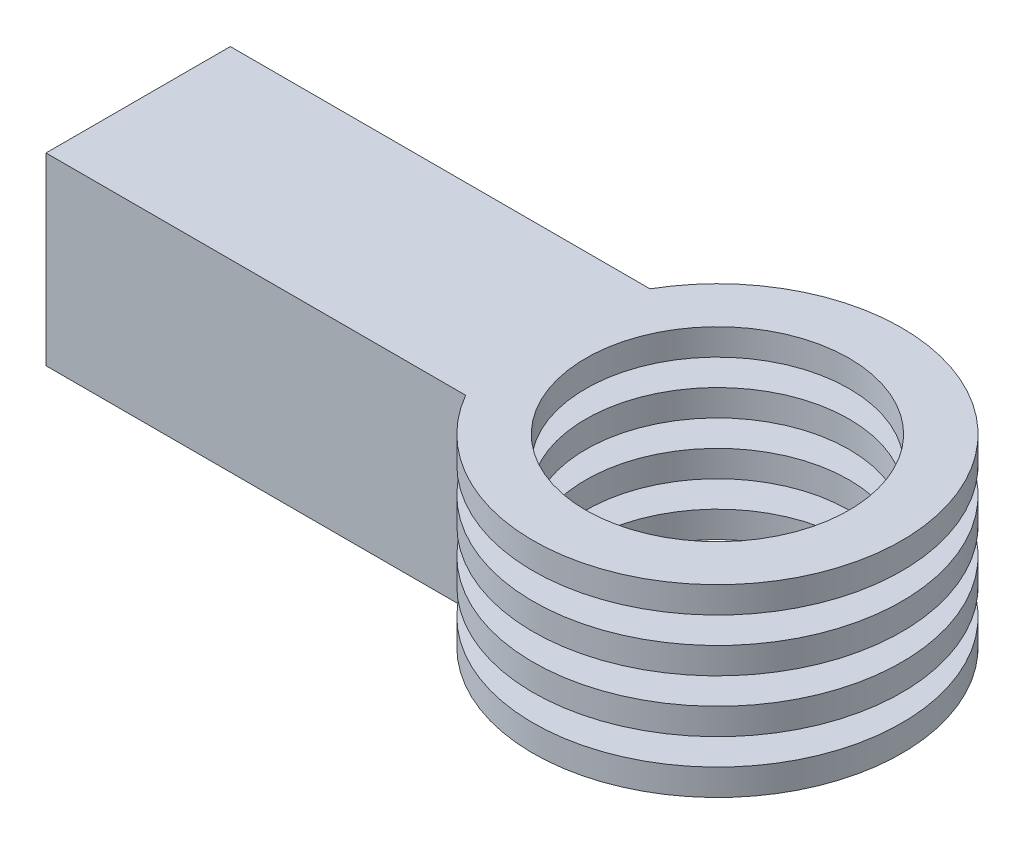
ISO-10303-21;
HEADER;
FILE_DESCRIPTION(('STEP AP214'),'2;1');
FILE_NAME('part.step','',(''),(''),'','','');
FILE_SCHEMA(('AUTOMOTIVE_DESIGN { 1 0 10303 214 1 1 1 1 }'));
ENDSEC;
DATA;
#1=APPLICATION_CONTEXT('core data for automotive mechanical design processes');
#2=APPLICATION_PROTOCOL_DEFINITION('international standard','automotive_design',2000,#1);
#3=PRODUCT_CONTEXT('',#1,'mechanical');
#4=PRODUCT('Part','Part','',(#3));
#5=PRODUCT_RELATED_PRODUCT_CATEGORY('part','',(#4));
#6=PRODUCT_DEFINITION_FORMATION('','',#4);
#7=PRODUCT_DEFINITION_CONTEXT('part definition',#1,'design');
#8=PRODUCT_DEFINITION('design','',#6,#7);
#9=PRODUCT_DEFINITION_SHAPE('','',#8);
#10=(LENGTH_UNIT() NAMED_UNIT(*) SI_UNIT(.MILLI.,.METRE.));
#11=(NAMED_UNIT(*) PLANE_ANGLE_UNIT() SI_UNIT($,.RADIAN.));
#12=(NAMED_UNIT(*) SI_UNIT($,.STERADIAN.) SOLID_ANGLE_UNIT());
#13=UNCERTAINTY_MEASURE_WITH_UNIT(LENGTH_MEASURE(1.E-05),#10,'distance_accuracy_value','');
#14=(GEOMETRIC_REPRESENTATION_CONTEXT(3) GLOBAL_UNCERTAINTY_ASSIGNED_CONTEXT((#13)) GLOBAL_UNIT_ASSIGNED_CONTEXT((#10,
#11,#12)) REPRESENTATION_CONTEXT('',''));
#15=CARTESIAN_POINT('',(0.,0.,0.));
#16=DIRECTION('',(0.,0.,1.));
#17=DIRECTION('',(1.,0.,0.));
#18=AXIS2_PLACEMENT_3D('',#15,#16,#17);
#19=CARTESIAN_POINT('',(2112.63357315488,38.1,-190.5));
#20=DIRECTION('',(-1.,0.,0.));
#21=DIRECTION('',(0.,0.,1.));
#22=AXIS2_PLACEMENT_3D('',#19,#20,#21);
#23=PLANE('',#22);
#24=DIRECTION('',(0.,0.,-1.));
#25=VECTOR('',#24,1.);
#26=CARTESIAN_POINT('',(2112.63357315488,13.6071428571429,-138.792857142857));
#27=LINE('',#26,#25);
#28=CARTESIAN_POINT('',(2112.63357315488,13.6071428571429,-138.792857142857));
#29=VERTEX_POINT('',#28);
#30=CARTESIAN_POINT('',(2112.63357315488,13.6071428571429,-166.007142857143));
#31=VERTEX_POINT('',#30);
#32=EDGE_CURVE('E51',#29,#31,#27,.T.);
#33=ORIENTED_EDGE('',*,*,#32,.F.);
#34=DIRECTION('',(0.,1.,0.));
#35=VECTOR('',#34,1.);
#36=CARTESIAN_POINT('',(2112.63357315488,-13.6071428571428,-138.792857142857));
#37=LINE('',#36,#35);
#38=CARTESIAN_POINT('',(2112.63357315488,-13.6071428571428,-138.792857142857));
#39=VERTEX_POINT('',#38);
#40=EDGE_CURVE('E158',#39,#29,#37,.T.);
#41=ORIENTED_EDGE('',*,*,#40,.F.);
#42=DIRECTION('',(0.,0.,1.));
#43=VECTOR('',#42,1.);
#44=CARTESIAN_POINT('',(2112.63357315488,-13.6071428571428,-166.007142857143));
#45=LINE('',#44,#43);
#46=CARTESIAN_POINT('',(2112.63357315488,-13.6071428571428,-166.007142857143));
#47=VERTEX_POINT('',#46);
#48=EDGE_CURVE('E161',#47,#39,#45,.T.);
#49=ORIENTED_EDGE('',*,*,#48,.F.);
#50=DIRECTION('',(0.,-1.,0.));
#51=VECTOR('',#50,1.);
#52=CARTESIAN_POINT('',(2112.63357315488,13.6071428571429,-166.007142857143));
#53=LINE('',#52,#51);
#54=EDGE_CURVE('E167',#31,#47,#53,.T.);
#55=ORIENTED_EDGE('',*,*,#54,.F.);
#56=EDGE_LOOP('',(#33,#41,#49,#55));
#57=FACE_BOUND('',#56,.T.);
#58=DIRECTION('',(0.,0.,1.));
#59=VECTOR('',#58,1.);
#60=CARTESIAN_POINT('',(2112.63357315488,38.1,-190.5));
#61=LINE('',#60,#59);
#62=CARTESIAN_POINT('',(2112.63357315488,38.1,-190.5));
#63=VERTEX_POINT('',#62);
#64=CARTESIAN_POINT('',(2112.63357315488,38.1,-114.3));
#65=VERTEX_POINT('',#64);
#66=EDGE_CURVE('E215',#63,#65,#61,.T.);
#67=ORIENTED_EDGE('',*,*,#66,.F.);
#68=DIRECTION('',(0.,1.,0.));
#69=VECTOR('',#68,1.);
#70=CARTESIAN_POINT('',(2112.63357315488,-38.1,-190.5));
#71=LINE('',#70,#69);
#72=CARTESIAN_POINT('',(2112.63357315488,-38.1,-190.5));
#73=VERTEX_POINT('',#72);
#74=EDGE_CURVE('E209',#73,#63,#71,.T.);
#75=ORIENTED_EDGE('',*,*,#74,.F.);
#76=DIRECTION('',(0.,0.,-1.));
#77=VECTOR('',#76,1.);
#78=CARTESIAN_POINT('',(2112.63357315488,-38.1,-114.3));
#79=LINE('',#78,#77);
#80=CARTESIAN_POINT('',(2112.63357315488,-38.1,-114.3));
#81=VERTEX_POINT('',#80);
#82=EDGE_CURVE('E211',#81,#73,#79,.T.);
#83=ORIENTED_EDGE('',*,*,#82,.F.);
#84=DIRECTION('',(0.,-1.,0.));
#85=VECTOR('',#84,1.);
#86=CARTESIAN_POINT('',(2112.63357315488,38.1,-114.3));
#87=LINE('',#86,#85);
#88=EDGE_CURVE('E213',#65,#81,#87,.T.);
#89=ORIENTED_EDGE('',*,*,#88,.F.);
#90=EDGE_LOOP('',(#67,#75,#83,#89));
#91=FACE_BOUND('',#90,.T.);
#92=ADVANCED_FACE('F35',(#57,#91),#23,.T.);
#93=CARTESIAN_POINT('',(2352.11928744059,-38.1,-152.4));
#94=DIRECTION('',(0.,1.,0.));
#95=DIRECTION('',(0.,0.,1.));
#96=AXIS2_PLACEMENT_3D('',#93,#94,#95);
#97=CYLINDRICAL_SURFACE('',#96,54.4285714285715);
#98=CARTESIAN_POINT('',(2352.11928744059,5.44285714285718,-152.4));
#99=DIRECTION('',(0.,1.,0.));
#100=DIRECTION('',(0.,0.,1.));
#101=AXIS2_PLACEMENT_3D('',#98,#99,#100);
#102=CIRCLE('',#101,54.4285714285715);
#103=CARTESIAN_POINT('',(2352.11928744059,5.44285714285718,-97.9714285714286));
#104=VERTEX_POINT('',#103);
#105=EDGE_CURVE('E177',#104,#104,#102,.F.);
#106=ORIENTED_EDGE('',*,*,#105,.T.);
#107=EDGE_LOOP('',(#106));
#108=FACE_BOUND('',#107,.T.);
#109=CARTESIAN_POINT('',(2352.11928744059,16.3285714285715,-152.4));
#110=DIRECTION('',(0.,1.,0.));
#111=DIRECTION('',(0.,0.,1.));
#112=AXIS2_PLACEMENT_3D('',#109,#110,#111);
#113=CIRCLE('',#112,54.4285714285715);
#114=CARTESIAN_POINT('',(2352.11928744059,16.3285714285715,-97.9714285714286));
#115=VERTEX_POINT('',#114);
#116=EDGE_CURVE('E186',#115,#115,#113,.F.);
#117=ORIENTED_EDGE('',*,*,#116,.F.);
#118=EDGE_LOOP('',(#117));
#119=FACE_BOUND('',#118,.T.);
#120=ADVANCED_FACE('F340',(#108,#119),#97,.F.);
#121=CARTESIAN_POINT('',(2352.11928744059,-16.3285714285714,-152.4));
#122=DIRECTION('',(0.,1.,0.));
#123=DIRECTION('',(0.,0.,1.));
#124=AXIS2_PLACEMENT_3D('',#121,#122,#123);
#125=CIRCLE('',#124,54.4285714285715);
#126=CARTESIAN_POINT('',(2352.11928744059,-16.3285714285714,-97.9714285714286));
#127=VERTEX_POINT('',#126);
#128=EDGE_CURVE('E190',#127,#127,#125,.F.);
#129=ORIENTED_EDGE('',*,*,#128,.T.);
#130=EDGE_LOOP('',(#129));
#131=FACE_BOUND('',#130,.T.);
#132=CARTESIAN_POINT('',(2352.11928744059,-5.4428571428571,-152.4));
#133=DIRECTION('',(0.,1.,0.));
#134=DIRECTION('',(0.,0.,1.));
#135=AXIS2_PLACEMENT_3D('',#132,#133,#134);
#136=CIRCLE('',#135,54.4285714285715);
#137=CARTESIAN_POINT('',(2352.11928744059,-5.4428571428571,-97.9714285714286));
#138=VERTEX_POINT('',#137);
#139=EDGE_CURVE('E180',#138,#138,#136,.F.);
#140=ORIENTED_EDGE('',*,*,#139,.F.);
#141=EDGE_LOOP('',(#140));
#142=FACE_BOUND('',#141,.T.);
#143=ADVANCED_FACE('F343',(#131,#142),#97,.F.);
#144=CARTESIAN_POINT('',(1764.29071601202,27.2142857142858,-152.4));
#145=DIRECTION('',(0.,1.,0.));
#146=DIRECTION('',(0.,0.,1.));
#147=AXIS2_PLACEMENT_3D('',#144,#145,#146);
#148=PLANE('',#147);
#149=CARTESIAN_POINT('',(2352.11928744059,27.2142857142858,-152.4));
#150=DIRECTION('',(0.,1.,0.));
#151=DIRECTION('',(0.,0.,1.));
#152=AXIS2_PLACEMENT_3D('',#149,#150,#151);
#153=CIRCLE('',#152,76.2);
#154=CARTESIAN_POINT('',(2286.12815167222,27.2142857142858,-190.5));
#155=VERTEX_POINT('',#154);
#156=CARTESIAN_POINT('',(2286.12815167222,27.2142857142858,-114.3));
#157=VERTEX_POINT('',#156);
#158=EDGE_CURVE('E43',#155,#157,#153,.T.);
#159=ORIENTED_EDGE('',*,*,#158,.F.);
#160=EDGE_CURVE('E11',#157,#155,#153,.T.);
#161=ORIENTED_EDGE('',*,*,#160,.F.);
#162=EDGE_LOOP('',(#159,#161));
#163=FACE_BOUND('',#162,.T.);
#164=CARTESIAN_POINT('',(2352.11928744059,27.2142857142858,-152.4));
#165=DIRECTION('',(0.,1.,0.));
#166=DIRECTION('',(0.,0.,1.));
#167=AXIS2_PLACEMENT_3D('',#164,#165,#166);
#168=CIRCLE('',#167,54.4285714285715);
#169=CARTESIAN_POINT('',(2352.11928744059,27.2142857142858,-97.9714285714286));
#170=VERTEX_POINT('',#169);
#171=EDGE_CURVE('E183',#170,#170,#168,.F.);
#172=ORIENTED_EDGE('',*,*,#171,.F.);
#173=EDGE_LOOP('',(#172));
#174=FACE_BOUND('',#173,.T.);
#175=ADVANCED_FACE('F325',(#163,#174),#148,.F.);
#176=CARTESIAN_POINT('',(1764.29071601202,16.3285714285715,-152.4));
#177=DIRECTION('',(0.,1.,0.));
#178=DIRECTION('',(0.,0.,1.));
#179=AXIS2_PLACEMENT_3D('',#176,#177,#178);
#180=PLANE('',#179);
#181=CARTESIAN_POINT('',(2352.11928744059,16.3285714285715,-152.4));
#182=DIRECTION('',(0.,1.,0.));
#183=DIRECTION('',(0.,0.,1.));
#184=AXIS2_PLACEMENT_3D('',#181,#182,#183);
#185=CIRCLE('',#184,76.2);
#186=CARTESIAN_POINT('',(2286.12815167222,16.3285714285715,-190.5));
#187=VERTEX_POINT('',#186);
#188=CARTESIAN_POINT('',(2286.12815167222,16.3285714285715,-114.3));
#189=VERTEX_POINT('',#188);
#190=EDGE_CURVE('E253',#187,#189,#185,.T.);
#191=ORIENTED_EDGE('',*,*,#190,.T.);
#192=EDGE_CURVE('E254',#189,#187,#185,.T.);
#193=ORIENTED_EDGE('',*,*,#192,.T.);
#194=EDGE_LOOP('',(#191,#193));
#195=FACE_BOUND('',#194,.T.);
#196=ORIENTED_EDGE('',*,*,#116,.T.);
#197=EDGE_LOOP('',(#196));
#198=FACE_BOUND('',#197,.T.);
#199=ADVANCED_FACE('F330',(#195,#198),#180,.T.);
#200=CARTESIAN_POINT('',(1764.29071601202,5.44285714285718,-152.4));
#201=DIRECTION('',(0.,1.,0.));
#202=DIRECTION('',(0.,0.,1.));
#203=AXIS2_PLACEMENT_3D('',#200,#201,#202);
#204=PLANE('',#203);
#205=CARTESIAN_POINT('',(2352.11928744059,5.44285714285718,-152.4));
#206=DIRECTION('',(0.,1.,0.));
#207=DIRECTION('',(0.,0.,1.));
#208=AXIS2_PLACEMENT_3D('',#205,#206,#207);
#209=CIRCLE('',#208,76.2);
#210=CARTESIAN_POINT('',(2286.12815167222,5.44285714285718,-190.5));
#211=VERTEX_POINT('',#210);
#212=CARTESIAN_POINT('',(2286.12815167222,5.44285714285718,-114.3));
#213=VERTEX_POINT('',#212);
#214=EDGE_CURVE('E38',#211,#213,#209,.T.);
#215=ORIENTED_EDGE('',*,*,#214,.F.);
#216=EDGE_CURVE('E255',#213,#211,#209,.T.);
#217=ORIENTED_EDGE('',*,*,#216,.F.);
#218=EDGE_LOOP('',(#215,#217));
#219=FACE_BOUND('',#218,.T.);
#220=ORIENTED_EDGE('',*,*,#105,.F.);
#221=EDGE_LOOP('',(#220));
#222=FACE_BOUND('',#221,.T.);
#223=ADVANCED_FACE('F333',(#219,#222),#204,.F.);
#224=CARTESIAN_POINT('',(1764.29071601202,-5.4428571428571,-152.4));
#225=DIRECTION('',(0.,1.,0.));
#226=DIRECTION('',(0.,0.,1.));
#227=AXIS2_PLACEMENT_3D('',#224,#225,#226);
#228=PLANE('',#227);
#229=CARTESIAN_POINT('',(2352.11928744059,-5.4428571428571,-152.4));
#230=DIRECTION('',(0.,1.,0.));
#231=DIRECTION('',(0.,0.,1.));
#232=AXIS2_PLACEMENT_3D('',#229,#230,#231);
#233=CIRCLE('',#232,76.2);
#234=CARTESIAN_POINT('',(2286.12815167222,-5.4428571428571,-190.5));
#235=VERTEX_POINT('',#234);
#236=CARTESIAN_POINT('',(2286.12815167222,-5.4428571428571,-114.3));
#237=VERTEX_POINT('',#236);
#238=EDGE_CURVE('E189',#235,#237,#233,.T.);
#239=ORIENTED_EDGE('',*,*,#238,.T.);
#240=EDGE_CURVE('E257',#237,#235,#233,.T.);
#241=ORIENTED_EDGE('',*,*,#240,.T.);
#242=EDGE_LOOP('',(#239,#241));
#243=FACE_BOUND('',#242,.T.);
#244=ORIENTED_EDGE('',*,*,#139,.T.);
#245=EDGE_LOOP('',(#244));
#246=FACE_BOUND('',#245,.T.);
#247=ADVANCED_FACE('F336',(#243,#246),#228,.T.);
#248=CARTESIAN_POINT('',(1764.29071601202,-16.3285714285714,-152.4));
#249=DIRECTION('',(0.,1.,0.));
#250=DIRECTION('',(0.,0.,1.));
#251=AXIS2_PLACEMENT_3D('',#248,#249,#250);
#252=PLANE('',#251);
#253=CARTESIAN_POINT('',(2352.11928744059,-16.3285714285714,-152.4));
#254=DIRECTION('',(0.,1.,0.));
#255=DIRECTION('',(0.,0.,1.));
#256=AXIS2_PLACEMENT_3D('',#253,#254,#255);
#257=CIRCLE('',#256,76.2);
#258=CARTESIAN_POINT('',(2286.12815167222,-16.3285714285714,-190.5));
#259=VERTEX_POINT('',#258);
#260=CARTESIAN_POINT('',(2286.12815167222,-16.3285714285714,-114.3));
#261=VERTEX_POINT('',#260);
#262=EDGE_CURVE('E246',#259,#261,#257,.T.);
#263=ORIENTED_EDGE('',*,*,#262,.F.);
#264=EDGE_CURVE('E249',#261,#259,#257,.T.);
#265=ORIENTED_EDGE('',*,*,#264,.F.);
#266=EDGE_LOOP('',(#263,#265));
#267=FACE_BOUND('',#266,.T.);
#268=ORIENTED_EDGE('',*,*,#128,.F.);
#269=EDGE_LOOP('',(#268));
#270=FACE_BOUND('',#269,.T.);
#271=ADVANCED_FACE('F294',(#267,#270),#252,.F.);
#272=CARTESIAN_POINT('',(1764.29071601202,-27.2142857142857,-152.4));
#273=DIRECTION('',(0.,1.,0.));
#274=DIRECTION('',(0.,0.,1.));
#275=AXIS2_PLACEMENT_3D('',#272,#273,#274);
#276=PLANE('',#275);
#277=CARTESIAN_POINT('',(2352.11928744059,-27.2142857142857,-152.4));
#278=DIRECTION('',(0.,1.,0.));
#279=DIRECTION('',(0.,0.,1.));
#280=AXIS2_PLACEMENT_3D('',#277,#278,#279);
#281=CIRCLE('',#280,76.2);
#282=CARTESIAN_POINT('',(2286.12815167222,-27.2142857142857,-190.5));
#283=VERTEX_POINT('',#282);
#284=CARTESIAN_POINT('',(2286.12815167222,-27.2142857142857,-114.3));
#285=VERTEX_POINT('',#284);
#286=EDGE_CURVE('E197',#283,#285,#281,.T.);
#287=ORIENTED_EDGE('',*,*,#286,.T.);
#288=EDGE_CURVE('E245',#285,#283,#281,.T.);
#289=ORIENTED_EDGE('',*,*,#288,.T.);
#290=EDGE_LOOP('',(#287,#289));
#291=FACE_BOUND('',#290,.T.);
#292=CARTESIAN_POINT('',(2352.11928744059,-27.2142857142857,-152.4));
#293=DIRECTION('',(0.,1.,0.));
#294=DIRECTION('',(0.,0.,1.));
#295=AXIS2_PLACEMENT_3D('',#292,#293,#294);
#296=CIRCLE('',#295,54.4285714285715);
#297=CARTESIAN_POINT('',(2352.11928744059,-27.2142857142857,-97.9714285714286));
#298=VERTEX_POINT('',#297);
#299=EDGE_CURVE('E193',#298,#298,#296,.F.);
#300=ORIENTED_EDGE('',*,*,#299,.T.);
#301=EDGE_LOOP('',(#300));
#302=FACE_BOUND('',#301,.T.);
#303=ADVANCED_FACE('F304',(#291,#302),#276,.T.);
#304=ORIENTED_EDGE('',*,*,#171,.T.);
#305=EDGE_LOOP('',(#304));
#306=FACE_BOUND('',#305,.T.);
#307=CARTESIAN_POINT('',(2352.11928744059,38.1,-152.4));
#308=DIRECTION('',(0.,1.,0.));
#309=DIRECTION('',(0.,0.,1.));
#310=AXIS2_PLACEMENT_3D('',#307,#308,#309);
#311=CIRCLE('',#310,54.4285714285715);
#312=CARTESIAN_POINT('',(2352.11928744059,38.1,-97.9714285714286));
#313=VERTEX_POINT('',#312);
#314=EDGE_CURVE('E235',#313,#313,#311,.T.);
#315=ORIENTED_EDGE('',*,*,#314,.T.);
#316=EDGE_LOOP('',(#315));
#317=FACE_BOUND('',#316,.T.);
#318=ADVANCED_FACE('F384',(#306,#317),#97,.F.);
#319=CARTESIAN_POINT('',(2275.91928744059,-38.1,-190.5));
#320=DIRECTION('',(0.,0.,1.));
#321=DIRECTION('',(0.,-1.,0.));
#322=AXIS2_PLACEMENT_3D('',#319,#320,#321);
#323=PLANE('',#322);
#324=ORIENTED_EDGE('',*,*,#74,.T.);
#325=DIRECTION('',(-1.,0.,0.));
#326=VECTOR('',#325,1.);
#327=CARTESIAN_POINT('',(2275.91928744059,38.1,-190.5));
#328=LINE('',#327,#326);
#329=CARTESIAN_POINT('',(2286.12815167222,38.1,-190.5));
#330=VERTEX_POINT('',#329);
#331=EDGE_CURVE('E206',#330,#63,#328,.T.);
#332=ORIENTED_EDGE('',*,*,#331,.F.);
#333=DIRECTION('',(0.,1.,0.));
#334=VECTOR('',#333,1.);
#335=CARTESIAN_POINT('',(2286.12815167222,-38.1,-190.5));
#336=LINE('',#335,#334);
#337=EDGE_CURVE('E226',#330,#155,#336,.F.);
#338=ORIENTED_EDGE('',*,*,#337,.T.);
#339=EDGE_CURVE('E232',#155,#187,#336,.F.);
#340=ORIENTED_EDGE('',*,*,#339,.T.);
#341=EDGE_CURVE('E272',#187,#211,#336,.F.);
#342=ORIENTED_EDGE('',*,*,#341,.T.);
#343=EDGE_CURVE('E281',#211,#235,#336,.F.);
#344=ORIENTED_EDGE('',*,*,#343,.T.);
#345=EDGE_CURVE('E233',#235,#259,#336,.F.);
#346=ORIENTED_EDGE('',*,*,#345,.T.);
#347=EDGE_CURVE('E234',#259,#283,#336,.F.);
#348=ORIENTED_EDGE('',*,*,#347,.T.);
#349=CARTESIAN_POINT('',(2286.12815167222,-38.1,-190.5));
#350=VERTEX_POINT('',#349);
#351=EDGE_CURVE('E241',#283,#350,#336,.F.);
#352=ORIENTED_EDGE('',*,*,#351,.T.);
#353=DIRECTION('',(-1.,0.,0.));
#354=VECTOR('',#353,1.);
#355=CARTESIAN_POINT('',(2275.91928744059,-38.1,-190.5));
#356=LINE('',#355,#354);
#357=EDGE_CURVE('E203',#350,#73,#356,.T.);
#358=ORIENTED_EDGE('',*,*,#357,.T.);
#359=EDGE_LOOP('',(#324,#332,#338,#340,#342,#344,#346,#348,#352,#358));
#360=FACE_BOUND('',#359,.T.);
#361=ADVANCED_FACE('F280',(#360),#323,.F.);
#362=CARTESIAN_POINT('',(2352.11928744059,-38.1,-152.4));
#363=DIRECTION('',(0.,1.,0.));
#364=DIRECTION('',(0.,0.,1.));
#365=AXIS2_PLACEMENT_3D('',#362,#363,#364);
#366=CIRCLE('',#365,54.4285714285715);
#367=CARTESIAN_POINT('',(2352.11928744059,-38.1,-97.9714285714286));
#368=VERTEX_POINT('',#367);
#369=EDGE_CURVE('E238',#368,#368,#366,.T.);
#370=ORIENTED_EDGE('',*,*,#369,.F.);
#371=EDGE_LOOP('',(#370));
#372=FACE_BOUND('',#371,.T.);
#373=ORIENTED_EDGE('',*,*,#299,.F.);
#374=EDGE_LOOP('',(#373));
#375=FACE_BOUND('',#374,.T.);
#376=ADVANCED_FACE('F345',(#372,#375),#97,.F.);
#377=CARTESIAN_POINT('',(2275.91928744059,38.1,-190.5));
#378=DIRECTION('',(0.,-1.,0.));
#379=DIRECTION('',(0.,0.,-1.));
#380=AXIS2_PLACEMENT_3D('',#377,#378,#379);
#381=PLANE('',#380);
#382=ORIENTED_EDGE('',*,*,#314,.F.);
#383=EDGE_LOOP('',(#382));
#384=FACE_BOUND('',#383,.T.);
#385=ORIENTED_EDGE('',*,*,#66,.T.);
#386=DIRECTION('',(-1.,0.,0.));
#387=VECTOR('',#386,1.);
#388=CARTESIAN_POINT('',(2275.91928744059,38.1,-114.3));
#389=LINE('',#388,#387);
#390=CARTESIAN_POINT('',(2286.12815167222,38.1,-114.3));
#391=VERTEX_POINT('',#390);
#392=EDGE_CURVE('E173',#391,#65,#389,.T.);
#393=ORIENTED_EDGE('',*,*,#392,.F.);
#394=CARTESIAN_POINT('',(2352.11928744059,38.1,-152.4));
#395=DIRECTION('',(0.,1.,0.));
#396=DIRECTION('',(0.,0.,1.));
#397=AXIS2_PLACEMENT_3D('',#394,#395,#396);
#398=CIRCLE('',#397,76.1999999999999);
#399=EDGE_CURVE('E223',#391,#330,#398,.T.);
#400=ORIENTED_EDGE('',*,*,#399,.T.);
#401=ORIENTED_EDGE('',*,*,#331,.T.);
#402=EDGE_LOOP('',(#385,#393,#400,#401));
#403=FACE_BOUND('',#402,.T.);
#404=ADVANCED_FACE('F318',(#384,#403),#381,.F.);
#405=CARTESIAN_POINT('',(2352.11928744059,-38.1,-152.4));
#406=DIRECTION('',(0.,1.,0.));
#407=DIRECTION('',(0.,0.,1.));
#408=AXIS2_PLACEMENT_3D('',#405,#406,#407);
#409=CYLINDRICAL_SURFACE('',#408,76.1999999999999);
#410=ORIENTED_EDGE('',*,*,#160,.T.);
#411=ORIENTED_EDGE('',*,*,#337,.F.);
#412=ORIENTED_EDGE('',*,*,#399,.F.);
#413=DIRECTION('',(0.,1.,0.));
#414=VECTOR('',#413,1.);
#415=CARTESIAN_POINT('',(2286.12815167222,-38.1,-114.3));
#416=LINE('',#415,#414);
#417=EDGE_CURVE('E222',#157,#391,#416,.T.);
#418=ORIENTED_EDGE('',*,*,#417,.F.);
#419=EDGE_LOOP('',(#410,#411,#412,#418));
#420=FACE_BOUND('',#419,.T.);
#421=ADVANCED_FACE('F322',(#420),#409,.T.);
#422=CARTESIAN_POINT('',(2352.11928744059,38.1,-152.4));
#423=DIRECTION('',(0.,1.,0.));
#424=DIRECTION('',(0.,0.,1.));
#425=AXIS2_PLACEMENT_3D('',#422,#423,#424);
#426=CYLINDRICAL_SURFACE('',#425,76.2);
#427=DIRECTION('',(0.,1.,0.));
#428=VECTOR('',#427,1.);
#429=CARTESIAN_POINT('',(2286.12815167222,38.1,-114.3));
#430=LINE('',#429,#428);
#431=EDGE_CURVE('E59',#157,#189,#430,.F.);
#432=ORIENTED_EDGE('',*,*,#431,.T.);
#433=ORIENTED_EDGE('',*,*,#190,.F.);
#434=ORIENTED_EDGE('',*,*,#339,.F.);
#435=ORIENTED_EDGE('',*,*,#158,.T.);
#436=EDGE_LOOP('',(#432,#433,#434,#435));
#437=FACE_BOUND('',#436,.T.);
#438=ADVANCED_FACE('F327',(#437),#426,.F.);
#439=ORIENTED_EDGE('',*,*,#216,.T.);
#440=ORIENTED_EDGE('',*,*,#341,.F.);
#441=ORIENTED_EDGE('',*,*,#192,.F.);
#442=EDGE_CURVE('E275',#213,#189,#416,.T.);
#443=ORIENTED_EDGE('',*,*,#442,.F.);
#444=EDGE_LOOP('',(#439,#440,#441,#443));
#445=FACE_BOUND('',#444,.T.);
#446=ADVANCED_FACE('F270',(#445),#409,.T.);
#447=CARTESIAN_POINT('',(2352.11928744059,38.1,-152.4));
#448=DIRECTION('',(0.,1.,0.));
#449=DIRECTION('',(0.,0.,1.));
#450=AXIS2_PLACEMENT_3D('',#447,#448,#449);
#451=CYLINDRICAL_SURFACE('',#450,76.2);
#452=DIRECTION('',(0.,1.,0.));
#453=VECTOR('',#452,1.);
#454=CARTESIAN_POINT('',(2286.12815167222,38.1,-114.3));
#455=LINE('',#454,#453);
#456=EDGE_CURVE('E250',#213,#237,#455,.F.);
#457=ORIENTED_EDGE('',*,*,#456,.T.);
#458=ORIENTED_EDGE('',*,*,#238,.F.);
#459=ORIENTED_EDGE('',*,*,#343,.F.);
#460=ORIENTED_EDGE('',*,*,#214,.T.);
#461=EDGE_LOOP('',(#457,#458,#459,#460));
#462=FACE_BOUND('',#461,.T.);
#463=ADVANCED_FACE('F332',(#462),#451,.F.);
#464=ORIENTED_EDGE('',*,*,#345,.F.);
#465=ORIENTED_EDGE('',*,*,#240,.F.);
#466=EDGE_CURVE('E221',#261,#237,#416,.T.);
#467=ORIENTED_EDGE('',*,*,#466,.F.);
#468=ORIENTED_EDGE('',*,*,#264,.T.);
#469=EDGE_LOOP('',(#464,#465,#467,#468));
#470=FACE_BOUND('',#469,.T.);
#471=ADVANCED_FACE('F296',(#470),#409,.T.);
#472=CARTESIAN_POINT('',(2352.11928744059,38.1,-152.4));
#473=DIRECTION('',(0.,1.,0.));
#474=DIRECTION('',(0.,0.,1.));
#475=AXIS2_PLACEMENT_3D('',#472,#473,#474);
#476=CYLINDRICAL_SURFACE('',#475,76.2);
#477=DIRECTION('',(0.,1.,0.));
#478=VECTOR('',#477,1.);
#479=CARTESIAN_POINT('',(2286.12815167222,38.1,-114.3));
#480=LINE('',#479,#478);
#481=EDGE_CURVE('E194',#261,#285,#480,.F.);
#482=ORIENTED_EDGE('',*,*,#481,.T.);
#483=ORIENTED_EDGE('',*,*,#286,.F.);
#484=ORIENTED_EDGE('',*,*,#347,.F.);
#485=ORIENTED_EDGE('',*,*,#262,.T.);
#486=EDGE_LOOP('',(#482,#483,#484,#485));
#487=FACE_BOUND('',#486,.T.);
#488=ADVANCED_FACE('F290',(#487),#476,.F.);
#489=ORIENTED_EDGE('',*,*,#351,.F.);
#490=ORIENTED_EDGE('',*,*,#288,.F.);
#491=CARTESIAN_POINT('',(2286.12815167222,-38.1,-114.3));
#492=VERTEX_POINT('',#491);
#493=EDGE_CURVE('E218',#492,#285,#416,.T.);
#494=ORIENTED_EDGE('',*,*,#493,.F.);
#495=CARTESIAN_POINT('',(2352.11928744059,-38.1,-152.4));
#496=DIRECTION('',(0.,1.,0.));
#497=DIRECTION('',(0.,0.,1.));
#498=AXIS2_PLACEMENT_3D('',#495,#496,#497);
#499=CIRCLE('',#498,76.1999999999999);
#500=EDGE_CURVE('E227',#492,#350,#499,.T.);
#501=ORIENTED_EDGE('',*,*,#500,.T.);
#502=EDGE_LOOP('',(#489,#490,#494,#501));
#503=FACE_BOUND('',#502,.T.);
#504=ADVANCED_FACE('F307',(#503),#409,.T.);
#505=CARTESIAN_POINT('',(2275.91928744059,-38.1,-114.3));
#506=DIRECTION('',(0.,1.,0.));
#507=DIRECTION('',(0.,0.,1.));
#508=AXIS2_PLACEMENT_3D('',#505,#506,#507);
#509=PLANE('',#508);
#510=ORIENTED_EDGE('',*,*,#369,.T.);
#511=EDGE_LOOP('',(#510));
#512=FACE_BOUND('',#511,.T.);
#513=ORIENTED_EDGE('',*,*,#357,.F.);
#514=ORIENTED_EDGE('',*,*,#500,.F.);
#515=DIRECTION('',(-1.,0.,0.));
#516=VECTOR('',#515,1.);
#517=CARTESIAN_POINT('',(2275.91928744059,-38.1,-114.3));
#518=LINE('',#517,#516);
#519=EDGE_CURVE('E200',#492,#81,#518,.T.);
#520=ORIENTED_EDGE('',*,*,#519,.T.);
#521=ORIENTED_EDGE('',*,*,#82,.T.);
#522=EDGE_LOOP('',(#513,#514,#520,#521));
#523=FACE_BOUND('',#522,.T.);
#524=ADVANCED_FACE('F310',(#512,#523),#509,.F.);
#525=CARTESIAN_POINT('',(2275.91928744059,38.1,-114.3));
#526=DIRECTION('',(0.,0.,-1.));
#527=DIRECTION('',(0.,1.,0.));
#528=AXIS2_PLACEMENT_3D('',#525,#526,#527);
#529=PLANE('',#528);
#530=ORIENTED_EDGE('',*,*,#88,.T.);
#531=ORIENTED_EDGE('',*,*,#519,.F.);
#532=ORIENTED_EDGE('',*,*,#493,.T.);
#533=ORIENTED_EDGE('',*,*,#481,.F.);
#534=ORIENTED_EDGE('',*,*,#466,.T.);
#535=ORIENTED_EDGE('',*,*,#456,.F.);
#536=ORIENTED_EDGE('',*,*,#442,.T.);
#537=ORIENTED_EDGE('',*,*,#431,.F.);
#538=ORIENTED_EDGE('',*,*,#417,.T.);
#539=ORIENTED_EDGE('',*,*,#392,.T.);
#540=EDGE_LOOP('',(#530,#531,#532,#533,#534,#535,#536,#537,#538,#539));
#541=FACE_BOUND('',#540,.T.);
#542=ADVANCED_FACE('F300',(#541),#529,.F.);
#543=CARTESIAN_POINT('',(2265.03357315488,13.6071428571429,-138.792857142857));
#544=DIRECTION('',(0.,1.,0.));
#545=DIRECTION('',(0.,0.,1.));
#546=AXIS2_PLACEMENT_3D('',#543,#544,#545);
#547=PLANE('',#546);
#548=ORIENTED_EDGE('',*,*,#32,.T.);
#549=DIRECTION('',(-1.,0.,0.));
#550=VECTOR('',#549,1.);
#551=CARTESIAN_POINT('',(2265.03357315488,13.6071428571429,-166.007142857143));
#552=LINE('',#551,#550);
#553=CARTESIAN_POINT('',(2265.03357315488,13.6071428571429,-166.007142857143));
#554=VERTEX_POINT('',#553);
#555=EDGE_CURVE('E136',#554,#31,#552,.T.);
#556=ORIENTED_EDGE('',*,*,#555,.F.);
#557=DIRECTION('',(0.,0.,-1.));
#558=VECTOR('',#557,1.);
#559=CARTESIAN_POINT('',(2265.03357315488,13.6071428571429,-138.792857142857));
#560=LINE('',#559,#558);
#561=CARTESIAN_POINT('',(2265.03357315488,13.6071428571429,-138.792857142857));
#562=VERTEX_POINT('',#561);
#563=EDGE_CURVE('E140',#562,#554,#560,.T.);
#564=ORIENTED_EDGE('',*,*,#563,.F.);
#565=DIRECTION('',(-1.,0.,0.));
#566=VECTOR('',#565,1.);
#567=CARTESIAN_POINT('',(2265.03357315488,13.6071428571429,-138.792857142857));
#568=LINE('',#567,#566);
#569=EDGE_CURVE('E171',#562,#29,#568,.T.);
#570=ORIENTED_EDGE('',*,*,#569,.T.);
#571=EDGE_LOOP('',(#548,#556,#564,#570));
#572=FACE_BOUND('',#571,.T.);
#573=ADVANCED_FACE('F138',(#572),#547,.F.);
#574=CARTESIAN_POINT('',(2265.03357315488,-13.6071428571428,-138.792857142857));
#575=DIRECTION('',(0.,0.,1.));
#576=DIRECTION('',(1.,0.,0.));
#577=AXIS2_PLACEMENT_3D('',#574,#575,#576);
#578=PLANE('',#577);
#579=ORIENTED_EDGE('',*,*,#40,.T.);
#580=ORIENTED_EDGE('',*,*,#569,.F.);
#581=DIRECTION('',(0.,1.,0.));
#582=VECTOR('',#581,1.);
#583=CARTESIAN_POINT('',(2265.03357315488,-13.6071428571428,-138.792857142857));
#584=LINE('',#583,#582);
#585=CARTESIAN_POINT('',(2265.03357315488,-13.6071428571428,-138.792857142857));
#586=VERTEX_POINT('',#585);
#587=EDGE_CURVE('E146',#586,#562,#584,.T.);
#588=ORIENTED_EDGE('',*,*,#587,.F.);
#589=DIRECTION('',(-1.,0.,0.));
#590=VECTOR('',#589,1.);
#591=CARTESIAN_POINT('',(2265.03357315488,-13.6071428571428,-138.792857142857));
#592=LINE('',#591,#590);
#593=EDGE_CURVE('E174',#586,#39,#592,.T.);
#594=ORIENTED_EDGE('',*,*,#593,.T.);
#595=EDGE_LOOP('',(#579,#580,#588,#594));
#596=FACE_BOUND('',#595,.T.);
#597=ADVANCED_FACE('F497',(#596),#578,.F.);
#598=CARTESIAN_POINT('',(2265.03357315488,-13.6071428571428,-166.007142857143));
#599=DIRECTION('',(0.,-1.,0.));
#600=DIRECTION('',(0.,0.,-1.));
#601=AXIS2_PLACEMENT_3D('',#598,#599,#600);
#602=PLANE('',#601);
#603=ORIENTED_EDGE('',*,*,#48,.T.);
#604=ORIENTED_EDGE('',*,*,#593,.F.);
#605=DIRECTION('',(0.,0.,1.));
#606=VECTOR('',#605,1.);
#607=CARTESIAN_POINT('',(2265.03357315488,-13.6071428571428,-166.007142857143));
#608=LINE('',#607,#606);
#609=CARTESIAN_POINT('',(2265.03357315488,-13.6071428571428,-166.007142857143));
#610=VERTEX_POINT('',#609);
#611=EDGE_CURVE('E154',#610,#586,#608,.T.);
#612=ORIENTED_EDGE('',*,*,#611,.F.);
#613=DIRECTION('',(-1.,0.,0.));
#614=VECTOR('',#613,1.);
#615=CARTESIAN_POINT('',(2265.03357315488,-13.6071428571428,-166.007142857143));
#616=LINE('',#615,#614);
#617=EDGE_CURVE('E145',#610,#47,#616,.T.);
#618=ORIENTED_EDGE('',*,*,#617,.T.);
#619=EDGE_LOOP('',(#603,#604,#612,#618));
#620=FACE_BOUND('',#619,.T.);
#621=ADVANCED_FACE('F505',(#620),#602,.F.);
#622=CARTESIAN_POINT('',(2265.03357315488,13.6071428571429,-166.007142857143));
#623=DIRECTION('',(0.,0.,-1.));
#624=DIRECTION('',(0.,1.,0.));
#625=AXIS2_PLACEMENT_3D('',#622,#623,#624);
#626=PLANE('',#625);
#627=ORIENTED_EDGE('',*,*,#54,.T.);
#628=ORIENTED_EDGE('',*,*,#617,.F.);
#629=DIRECTION('',(0.,-1.,0.));
#630=VECTOR('',#629,1.);
#631=CARTESIAN_POINT('',(2265.03357315488,13.6071428571429,-166.007142857143));
#632=LINE('',#631,#630);
#633=EDGE_CURVE('E149',#554,#610,#632,.T.);
#634=ORIENTED_EDGE('',*,*,#633,.F.);
#635=ORIENTED_EDGE('',*,*,#555,.T.);
#636=EDGE_LOOP('',(#627,#628,#634,#635));
#637=FACE_BOUND('',#636,.T.);
#638=ADVANCED_FACE('F150',(#637),#626,.F.);
#639=CARTESIAN_POINT('',(2265.03357315488,0.,-119.742857142857));
#640=DIRECTION('',(-1.,0.,0.));
#641=DIRECTION('',(0.,0.,1.));
#642=AXIS2_PLACEMENT_3D('',#639,#640,#641);
#643=PLANE('',#642);
#644=ORIENTED_EDGE('',*,*,#563,.T.);
#645=ORIENTED_EDGE('',*,*,#633,.T.);
#646=ORIENTED_EDGE('',*,*,#611,.T.);
#647=ORIENTED_EDGE('',*,*,#587,.T.);
#648=EDGE_LOOP('',(#644,#645,#646,#647));
#649=FACE_BOUND('',#648,.T.);
#650=ADVANCED_FACE('F156',(#649),#643,.T.);
#651=CLOSED_SHELL('',(#92,#120,#143,#175,#199,#223,#247,#271,#303,#318,#361,#376,#404,#421,#438,
#446,#463,#471,#488,#504,#524,#542,#573,#597,#621,#638,#650));
#652=MANIFOLD_SOLID_BREP('B2',#651);
#653=ADVANCED_BREP_SHAPE_REPRESENTATION('',(#18,#652),#14);
#654=SHAPE_DEFINITION_REPRESENTATION(#9,#653);
ENDSEC;
END-ISO-10303-21;
